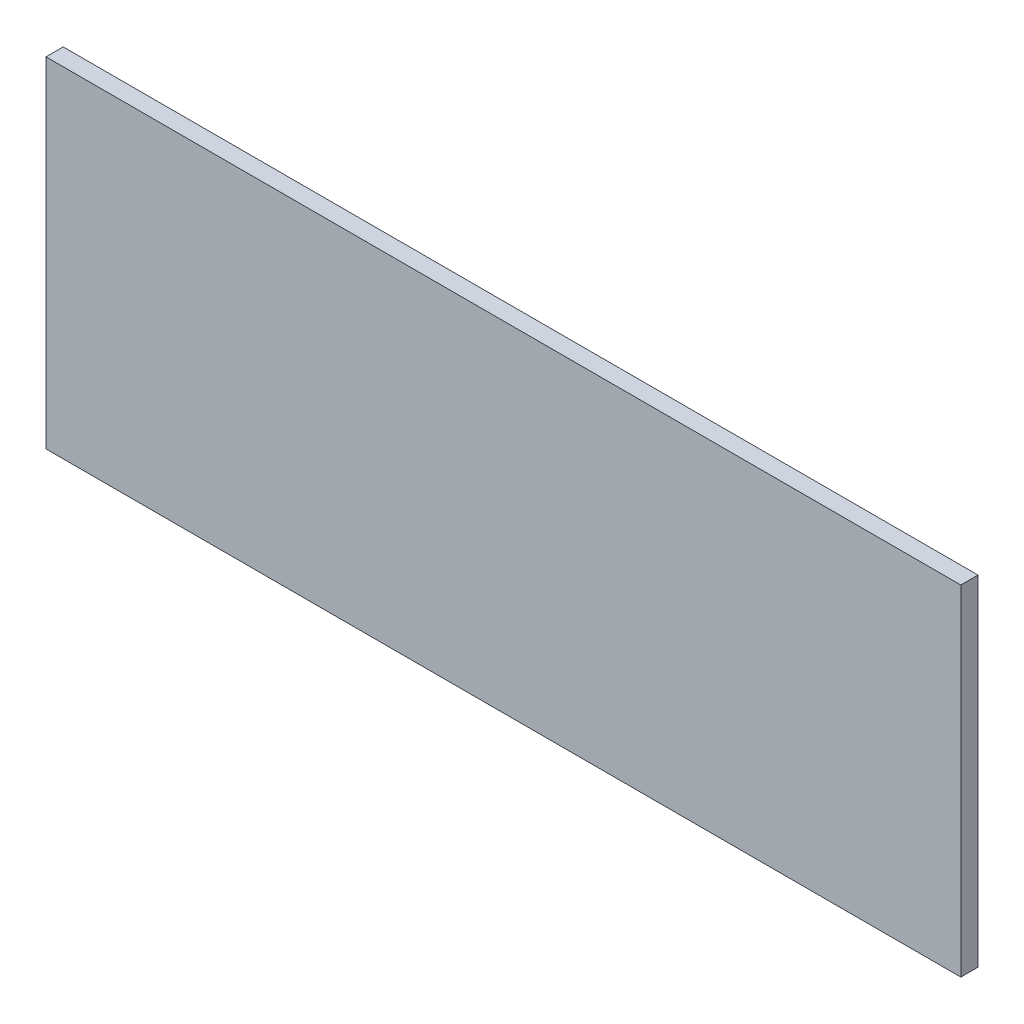
ISO-10303-21;
HEADER;
FILE_DESCRIPTION(('STEP AP214'),'2;1');
FILE_NAME('part.step','',(''),(''),'','','');
FILE_SCHEMA(('AUTOMOTIVE_DESIGN { 1 0 10303 214 1 1 1 1 }'));
ENDSEC;
DATA;
#1=APPLICATION_CONTEXT('core data for automotive mechanical design processes');
#2=APPLICATION_PROTOCOL_DEFINITION('international standard','automotive_design',2000,#1);
#3=PRODUCT_CONTEXT('',#1,'mechanical');
#4=PRODUCT('Part','Part','',(#3));
#5=PRODUCT_RELATED_PRODUCT_CATEGORY('part','',(#4));
#6=PRODUCT_DEFINITION_FORMATION('','',#4);
#7=PRODUCT_DEFINITION_CONTEXT('part definition',#1,'design');
#8=PRODUCT_DEFINITION('design','',#6,#7);
#9=PRODUCT_DEFINITION_SHAPE('','',#8);
#10=(LENGTH_UNIT() NAMED_UNIT(*) SI_UNIT(.MILLI.,.METRE.));
#11=(NAMED_UNIT(*) PLANE_ANGLE_UNIT() SI_UNIT($,.RADIAN.));
#12=(NAMED_UNIT(*) SI_UNIT($,.STERADIAN.) SOLID_ANGLE_UNIT());
#13=UNCERTAINTY_MEASURE_WITH_UNIT(LENGTH_MEASURE(1.E-05),#10,'distance_accuracy_value','');
#14=(GEOMETRIC_REPRESENTATION_CONTEXT(3) GLOBAL_UNCERTAINTY_ASSIGNED_CONTEXT((#13)) GLOBAL_UNIT_ASSIGNED_CONTEXT((#10,
#11,#12)) REPRESENTATION_CONTEXT('',''));
#15=CARTESIAN_POINT('',(0.,0.,0.));
#16=DIRECTION('',(0.,0.,1.));
#17=DIRECTION('',(1.,0.,0.));
#18=AXIS2_PLACEMENT_3D('',#15,#16,#17);
#19=CARTESIAN_POINT('',(6.,5.99999999999998,6.));
#20=DIRECTION('',(-1.,0.,0.));
#21=DIRECTION('',(0.,-1.,0.));
#22=AXIS2_PLACEMENT_3D('',#19,#20,#21);
#23=PLANE('',#22);
#24=DIRECTION('',(0.,1.,0.));
#25=VECTOR('',#24,1.);
#26=CARTESIAN_POINT('',(6.,5.99999999999998,0.));
#27=LINE('',#26,#25);
#28=CARTESIAN_POINT('',(6.00000000000002,-112.414906094222,0.));
#29=VERTEX_POINT('',#28);
#30=CARTESIAN_POINT('',(6.,5.99999999999998,0.));
#31=VERTEX_POINT('',#30);
#32=EDGE_CURVE('E96',#29,#31,#27,.T.);
#33=ORIENTED_EDGE('',*,*,#32,.T.);
#34=DIRECTION('',(0.,0.,-1.));
#35=VECTOR('',#34,1.);
#36=CARTESIAN_POINT('',(6.,5.99999999999998,6.));
#37=LINE('',#36,#35);
#38=CARTESIAN_POINT('',(6.,5.99999999999998,6.));
#39=VERTEX_POINT('',#38);
#40=EDGE_CURVE('E11',#39,#31,#37,.T.);
#41=ORIENTED_EDGE('',*,*,#40,.F.);
#42=DIRECTION('',(0.,1.,0.));
#43=VECTOR('',#42,1.);
#44=CARTESIAN_POINT('',(6.,5.99999999999998,6.));
#45=LINE('',#44,#43);
#46=CARTESIAN_POINT('',(6.00000000000002,-112.414906094222,6.));
#47=VERTEX_POINT('',#46);
#48=EDGE_CURVE('E84',#47,#39,#45,.T.);
#49=ORIENTED_EDGE('',*,*,#48,.F.);
#50=DIRECTION('',(0.,0.,-1.));
#51=VECTOR('',#50,1.);
#52=CARTESIAN_POINT('',(6.00000000000002,-112.414906094222,6.));
#53=LINE('',#52,#51);
#54=EDGE_CURVE('E92',#47,#29,#53,.T.);
#55=ORIENTED_EDGE('',*,*,#54,.T.);
#56=EDGE_LOOP('',(#33,#41,#49,#55));
#57=FACE_BOUND('',#56,.T.);
#58=ADVANCED_FACE('F33',(#57),#23,.F.);
#59=CARTESIAN_POINT('',(6.,5.99999999999998,6.));
#60=DIRECTION('',(0.,-1.,0.));
#61=DIRECTION('',(1.,0.,0.));
#62=AXIS2_PLACEMENT_3D('',#59,#60,#61);
#63=PLANE('',#62);
#64=DIRECTION('',(-1.,0.,0.));
#65=VECTOR('',#64,1.);
#66=CARTESIAN_POINT('',(6.,5.99999999999998,0.));
#67=LINE('',#66,#65);
#68=CARTESIAN_POINT('',(-313.,5.99999999999994,0.));
#69=VERTEX_POINT('',#68);
#70=EDGE_CURVE('E88',#31,#69,#67,.T.);
#71=ORIENTED_EDGE('',*,*,#70,.T.);
#72=DIRECTION('',(0.,0.,-1.));
#73=VECTOR('',#72,1.);
#74=CARTESIAN_POINT('',(-313.,5.99999999999994,6.));
#75=LINE('',#74,#73);
#76=CARTESIAN_POINT('',(-313.,5.99999999999994,6.));
#77=VERTEX_POINT('',#76);
#78=EDGE_CURVE('E41',#77,#69,#75,.T.);
#79=ORIENTED_EDGE('',*,*,#78,.F.);
#80=DIRECTION('',(-1.,0.,0.));
#81=VECTOR('',#80,1.);
#82=CARTESIAN_POINT('',(6.,5.99999999999998,6.));
#83=LINE('',#82,#81);
#84=EDGE_CURVE('E79',#39,#77,#83,.T.);
#85=ORIENTED_EDGE('',*,*,#84,.F.);
#86=ORIENTED_EDGE('',*,*,#40,.T.);
#87=EDGE_LOOP('',(#71,#79,#85,#86));
#88=FACE_BOUND('',#87,.T.);
#89=ADVANCED_FACE('F87',(#88),#63,.F.);
#90=CARTESIAN_POINT('',(-313.,5.99999999999994,6.));
#91=DIRECTION('',(1.,0.,0.));
#92=DIRECTION('',(0.,0.,-1.));
#93=AXIS2_PLACEMENT_3D('',#90,#91,#92);
#94=PLANE('',#93);
#95=DIRECTION('',(0.,-1.,0.));
#96=VECTOR('',#95,1.);
#97=CARTESIAN_POINT('',(-313.,5.99999999999994,0.));
#98=LINE('',#97,#96);
#99=CARTESIAN_POINT('',(-313.,-112.414906094222,0.));
#100=VERTEX_POINT('',#99);
#101=EDGE_CURVE('E66',#69,#100,#98,.T.);
#102=ORIENTED_EDGE('',*,*,#101,.T.);
#103=DIRECTION('',(0.,0.,-1.));
#104=VECTOR('',#103,1.);
#105=CARTESIAN_POINT('',(-313.,-112.414906094222,6.));
#106=LINE('',#105,#104);
#107=CARTESIAN_POINT('',(-313.,-112.414906094222,6.));
#108=VERTEX_POINT('',#107);
#109=EDGE_CURVE('E89',#108,#100,#106,.T.);
#110=ORIENTED_EDGE('',*,*,#109,.F.);
#111=DIRECTION('',(0.,-1.,0.));
#112=VECTOR('',#111,1.);
#113=CARTESIAN_POINT('',(-313.,5.99999999999994,6.));
#114=LINE('',#113,#112);
#115=EDGE_CURVE('E82',#77,#108,#114,.T.);
#116=ORIENTED_EDGE('',*,*,#115,.F.);
#117=ORIENTED_EDGE('',*,*,#78,.T.);
#118=EDGE_LOOP('',(#102,#110,#116,#117));
#119=FACE_BOUND('',#118,.T.);
#120=ADVANCED_FACE('F90',(#119),#94,.F.);
#121=CARTESIAN_POINT('',(6.00000000000002,-112.414906094222,6.));
#122=DIRECTION('',(0.,1.,0.));
#123=DIRECTION('',(-1.,0.,0.));
#124=AXIS2_PLACEMENT_3D('',#121,#122,#123);
#125=PLANE('',#124);
#126=DIRECTION('',(1.,0.,0.));
#127=VECTOR('',#126,1.);
#128=CARTESIAN_POINT('',(6.00000000000002,-112.414906094222,0.));
#129=LINE('',#128,#127);
#130=EDGE_CURVE('E72',#100,#29,#129,.T.);
#131=ORIENTED_EDGE('',*,*,#130,.T.);
#132=ORIENTED_EDGE('',*,*,#54,.F.);
#133=DIRECTION('',(1.,0.,0.));
#134=VECTOR('',#133,1.);
#135=CARTESIAN_POINT('',(6.00000000000002,-112.414906094222,6.));
#136=LINE('',#135,#134);
#137=EDGE_CURVE('E49',#108,#47,#136,.T.);
#138=ORIENTED_EDGE('',*,*,#137,.F.);
#139=ORIENTED_EDGE('',*,*,#109,.T.);
#140=EDGE_LOOP('',(#131,#132,#138,#139));
#141=FACE_BOUND('',#140,.T.);
#142=ADVANCED_FACE('F103',(#141),#125,.F.);
#143=CARTESIAN_POINT('',(0.,0.,6.));
#144=DIRECTION('',(0.,0.,-1.));
#145=DIRECTION('',(-1.,0.,0.));
#146=AXIS2_PLACEMENT_3D('',#143,#144,#145);
#147=PLANE('',#146);
#148=ORIENTED_EDGE('',*,*,#48,.T.);
#149=ORIENTED_EDGE('',*,*,#84,.T.);
#150=ORIENTED_EDGE('',*,*,#115,.T.);
#151=ORIENTED_EDGE('',*,*,#137,.T.);
#152=EDGE_LOOP('',(#148,#149,#150,#151));
#153=FACE_BOUND('',#152,.T.);
#154=ADVANCED_FACE('F80',(#153),#147,.F.);
#155=CARTESIAN_POINT('',(0.,0.,0.));
#156=DIRECTION('',(0.,0.,-1.));
#157=DIRECTION('',(-1.,0.,0.));
#158=AXIS2_PLACEMENT_3D('',#155,#156,#157);
#159=PLANE('',#158);
#160=ORIENTED_EDGE('',*,*,#32,.F.);
#161=ORIENTED_EDGE('',*,*,#130,.F.);
#162=ORIENTED_EDGE('',*,*,#101,.F.);
#163=ORIENTED_EDGE('',*,*,#70,.F.);
#164=EDGE_LOOP('',(#160,#161,#162,#163));
#165=FACE_BOUND('',#164,.T.);
#166=ADVANCED_FACE('F106',(#165),#159,.T.);
#167=CLOSED_SHELL('',(#58,#89,#120,#142,#154,#166));
#168=MANIFOLD_SOLID_BREP('B2',#167);
#169=ADVANCED_BREP_SHAPE_REPRESENTATION('',(#18,#168),#14);
#170=SHAPE_DEFINITION_REPRESENTATION(#9,#169);
ENDSEC;
END-ISO-10303-21;
